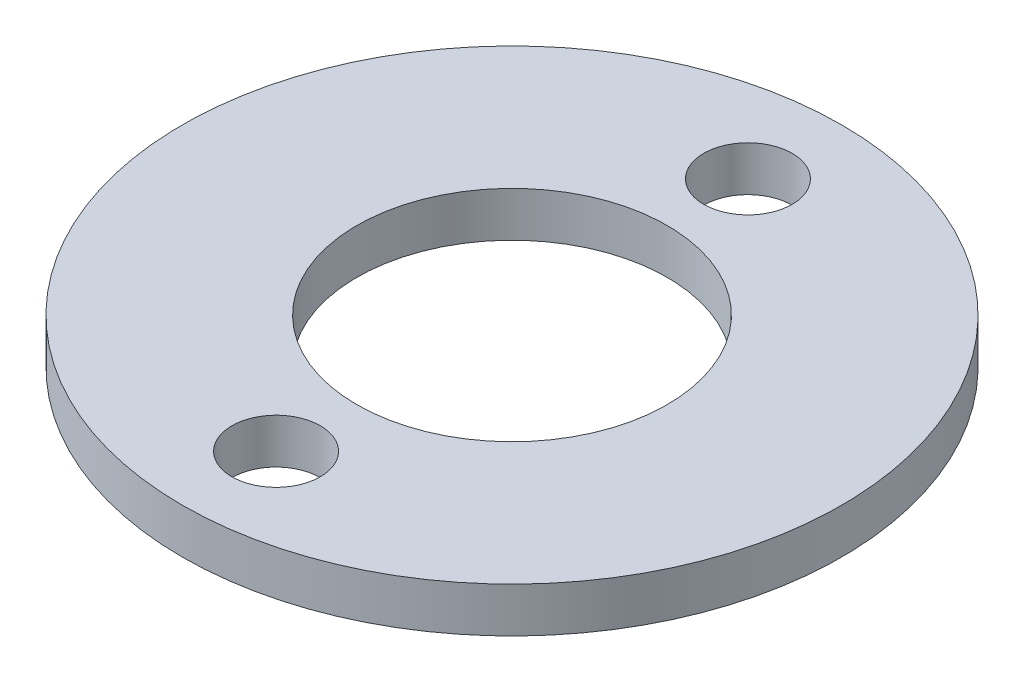
ISO-10303-21;
HEADER;
FILE_DESCRIPTION(('STEP AP214'),'2;1');
FILE_NAME('part.step','',(''),(''),'','','');
FILE_SCHEMA(('AUTOMOTIVE_DESIGN { 1 0 10303 214 1 1 1 1 }'));
ENDSEC;
DATA;
#1=APPLICATION_CONTEXT('core data for automotive mechanical design processes');
#2=APPLICATION_PROTOCOL_DEFINITION('international standard','automotive_design',2000,#1);
#3=PRODUCT_CONTEXT('',#1,'mechanical');
#4=PRODUCT('Part','Part','',(#3));
#5=PRODUCT_RELATED_PRODUCT_CATEGORY('part','',(#4));
#6=PRODUCT_DEFINITION_FORMATION('','',#4);
#7=PRODUCT_DEFINITION_CONTEXT('part definition',#1,'design');
#8=PRODUCT_DEFINITION('design','',#6,#7);
#9=PRODUCT_DEFINITION_SHAPE('','',#8);
#10=(LENGTH_UNIT() NAMED_UNIT(*) SI_UNIT(.MILLI.,.METRE.));
#11=(NAMED_UNIT(*) PLANE_ANGLE_UNIT() SI_UNIT($,.RADIAN.));
#12=(NAMED_UNIT(*) SI_UNIT($,.STERADIAN.) SOLID_ANGLE_UNIT());
#13=UNCERTAINTY_MEASURE_WITH_UNIT(LENGTH_MEASURE(1.E-05),#10,'distance_accuracy_value','');
#14=(GEOMETRIC_REPRESENTATION_CONTEXT(3) GLOBAL_UNCERTAINTY_ASSIGNED_CONTEXT((#13)) GLOBAL_UNIT_ASSIGNED_CONTEXT((#10,
#11,#12)) REPRESENTATION_CONTEXT('',''));
#15=CARTESIAN_POINT('',(0.,0.,0.));
#16=DIRECTION('',(0.,0.,1.));
#17=DIRECTION('',(1.,0.,0.));
#18=AXIS2_PLACEMENT_3D('',#15,#16,#17);
#19=CARTESIAN_POINT('',(0.,3.,0.));
#20=DIRECTION('',(0.,-1.,0.));
#21=DIRECTION('',(0.,0.,-1.));
#22=AXIS2_PLACEMENT_3D('',#19,#20,#21);
#23=CYLINDRICAL_SURFACE('',#22,22.);
#24=CARTESIAN_POINT('',(0.,3.,0.));
#25=DIRECTION('',(0.,1.,0.));
#26=DIRECTION('',(0.,0.,1.));
#27=AXIS2_PLACEMENT_3D('',#24,#25,#26);
#28=CIRCLE('',#27,22.);
#29=CARTESIAN_POINT('',(0.,3.,22.));
#30=VERTEX_POINT('',#29);
#31=EDGE_CURVE('E10',#30,#30,#28,.T.);
#32=ORIENTED_EDGE('',*,*,#31,.F.);
#33=EDGE_LOOP('',(#32));
#34=FACE_BOUND('',#33,.T.);
#35=CARTESIAN_POINT('',(0.,0.,0.));
#36=DIRECTION('',(0.,1.,0.));
#37=DIRECTION('',(0.,0.,1.));
#38=AXIS2_PLACEMENT_3D('',#35,#36,#37);
#39=CIRCLE('',#38,22.);
#40=CARTESIAN_POINT('',(0.,0.,22.));
#41=VERTEX_POINT('',#40);
#42=EDGE_CURVE('E40',#41,#41,#39,.T.);
#43=ORIENTED_EDGE('',*,*,#42,.T.);
#44=EDGE_LOOP('',(#43));
#45=FACE_BOUND('',#44,.T.);
#46=ADVANCED_FACE('F37',(#34,#45),#23,.T.);
#47=CARTESIAN_POINT('',(0.,3.,0.));
#48=DIRECTION('',(0.,1.,0.));
#49=DIRECTION('',(0.,0.,1.));
#50=AXIS2_PLACEMENT_3D('',#47,#48,#49);
#51=PLANE('',#50);
#52=CARTESIAN_POINT('',(0.,3.,15.75));
#53=DIRECTION('',(0.,1.,0.));
#54=DIRECTION('',(0.,0.,-1.));
#55=AXIS2_PLACEMENT_3D('',#52,#53,#54);
#56=CIRCLE('',#55,2.952);
#57=CARTESIAN_POINT('',(0.,3.,12.798));
#58=VERTEX_POINT('',#57);
#59=EDGE_CURVE('E58',#58,#58,#56,.T.);
#60=ORIENTED_EDGE('',*,*,#59,.F.);
#61=EDGE_LOOP('',(#60));
#62=FACE_BOUND('',#61,.T.);
#63=CARTESIAN_POINT('',(0.,3.,-15.75));
#64=DIRECTION('',(0.,1.,0.));
#65=DIRECTION('',(0.,0.,1.));
#66=AXIS2_PLACEMENT_3D('',#63,#64,#65);
#67=CIRCLE('',#66,2.952);
#68=CARTESIAN_POINT('',(0.,3.,-12.798));
#69=VERTEX_POINT('',#68);
#70=EDGE_CURVE('E52',#69,#69,#67,.T.);
#71=ORIENTED_EDGE('',*,*,#70,.F.);
#72=EDGE_LOOP('',(#71));
#73=FACE_BOUND('',#72,.T.);
#74=CARTESIAN_POINT('',(0.,3.,0.));
#75=DIRECTION('',(0.,1.,0.));
#76=DIRECTION('',(0.,0.,1.));
#77=AXIS2_PLACEMENT_3D('',#74,#75,#76);
#78=CIRCLE('',#77,10.36);
#79=CARTESIAN_POINT('',(0.,3.,10.36));
#80=VERTEX_POINT('',#79);
#81=EDGE_CURVE('E49',#80,#80,#78,.T.);
#82=ORIENTED_EDGE('',*,*,#81,.F.);
#83=EDGE_LOOP('',(#82));
#84=FACE_BOUND('',#83,.T.);
#85=ORIENTED_EDGE('',*,*,#31,.T.);
#86=EDGE_LOOP('',(#85));
#87=FACE_BOUND('',#86,.T.);
#88=ADVANCED_FACE('F69',(#62,#73,#84,#87),#51,.T.);
#89=CARTESIAN_POINT('',(0.,0.,0.));
#90=DIRECTION('',(0.,1.,0.));
#91=DIRECTION('',(0.,0.,1.));
#92=AXIS2_PLACEMENT_3D('',#89,#90,#91);
#93=PLANE('',#92);
#94=CARTESIAN_POINT('',(0.,0.,15.75));
#95=DIRECTION('',(0.,1.,0.));
#96=DIRECTION('',(0.,0.,-1.));
#97=AXIS2_PLACEMENT_3D('',#94,#95,#96);
#98=CIRCLE('',#97,2.952);
#99=CARTESIAN_POINT('',(0.,0.,12.798));
#100=VERTEX_POINT('',#99);
#101=EDGE_CURVE('E55',#100,#100,#98,.T.);
#102=ORIENTED_EDGE('',*,*,#101,.T.);
#103=EDGE_LOOP('',(#102));
#104=FACE_BOUND('',#103,.T.);
#105=CARTESIAN_POINT('',(0.,0.,-15.75));
#106=DIRECTION('',(0.,1.,0.));
#107=DIRECTION('',(0.,0.,1.));
#108=AXIS2_PLACEMENT_3D('',#105,#106,#107);
#109=CIRCLE('',#108,2.952);
#110=CARTESIAN_POINT('',(0.,0.,-12.798));
#111=VERTEX_POINT('',#110);
#112=EDGE_CURVE('E61',#111,#111,#109,.T.);
#113=ORIENTED_EDGE('',*,*,#112,.T.);
#114=EDGE_LOOP('',(#113));
#115=FACE_BOUND('',#114,.T.);
#116=CARTESIAN_POINT('',(0.,0.,0.));
#117=DIRECTION('',(0.,1.,0.));
#118=DIRECTION('',(0.,0.,1.));
#119=AXIS2_PLACEMENT_3D('',#116,#117,#118);
#120=CIRCLE('',#119,10.36);
#121=CARTESIAN_POINT('',(0.,0.,10.36));
#122=VERTEX_POINT('',#121);
#123=EDGE_CURVE('E47',#122,#122,#120,.T.);
#124=ORIENTED_EDGE('',*,*,#123,.T.);
#125=EDGE_LOOP('',(#124));
#126=FACE_BOUND('',#125,.T.);
#127=ORIENTED_EDGE('',*,*,#42,.F.);
#128=EDGE_LOOP('',(#127));
#129=FACE_BOUND('',#128,.T.);
#130=ADVANCED_FACE('F72',(#104,#115,#126,#129),#93,.F.);
#131=CARTESIAN_POINT('',(0.,0.,0.));
#132=DIRECTION('',(0.,1.,0.));
#133=DIRECTION('',(0.,0.,1.));
#134=AXIS2_PLACEMENT_3D('',#131,#132,#133);
#135=CYLINDRICAL_SURFACE('',#134,10.36);
#136=ORIENTED_EDGE('',*,*,#123,.F.);
#137=EDGE_LOOP('',(#136));
#138=FACE_BOUND('',#137,.T.);
#139=ORIENTED_EDGE('',*,*,#81,.T.);
#140=EDGE_LOOP('',(#139));
#141=FACE_BOUND('',#140,.T.);
#142=ADVANCED_FACE('F77',(#138,#141),#135,.F.);
#143=CARTESIAN_POINT('',(0.,0.,-15.75));
#144=DIRECTION('',(0.,1.,0.));
#145=DIRECTION('',(0.,0.,1.));
#146=AXIS2_PLACEMENT_3D('',#143,#144,#145);
#147=CYLINDRICAL_SURFACE('',#146,2.952);
#148=ORIENTED_EDGE('',*,*,#112,.F.);
#149=EDGE_LOOP('',(#148));
#150=FACE_BOUND('',#149,.T.);
#151=ORIENTED_EDGE('',*,*,#70,.T.);
#152=EDGE_LOOP('',(#151));
#153=FACE_BOUND('',#152,.T.);
#154=ADVANCED_FACE('F67',(#150,#153),#147,.F.);
#155=CARTESIAN_POINT('',(0.,0.,15.75));
#156=DIRECTION('',(0.,1.,0.));
#157=DIRECTION('',(0.,0.,1.));
#158=AXIS2_PLACEMENT_3D('',#155,#156,#157);
#159=CYLINDRICAL_SURFACE('',#158,2.952);
#160=ORIENTED_EDGE('',*,*,#101,.F.);
#161=EDGE_LOOP('',(#160));
#162=FACE_BOUND('',#161,.T.);
#163=ORIENTED_EDGE('',*,*,#59,.T.);
#164=EDGE_LOOP('',(#163));
#165=FACE_BOUND('',#164,.T.);
#166=ADVANCED_FACE('F85',(#162,#165),#159,.F.);
#167=CLOSED_SHELL('',(#46,#88,#130,#142,#154,#166));
#168=MANIFOLD_SOLID_BREP('B2',#167);
#169=ADVANCED_BREP_SHAPE_REPRESENTATION('',(#18,#168),#14);
#170=SHAPE_DEFINITION_REPRESENTATION(#9,#169);
ENDSEC;
END-ISO-10303-21;
